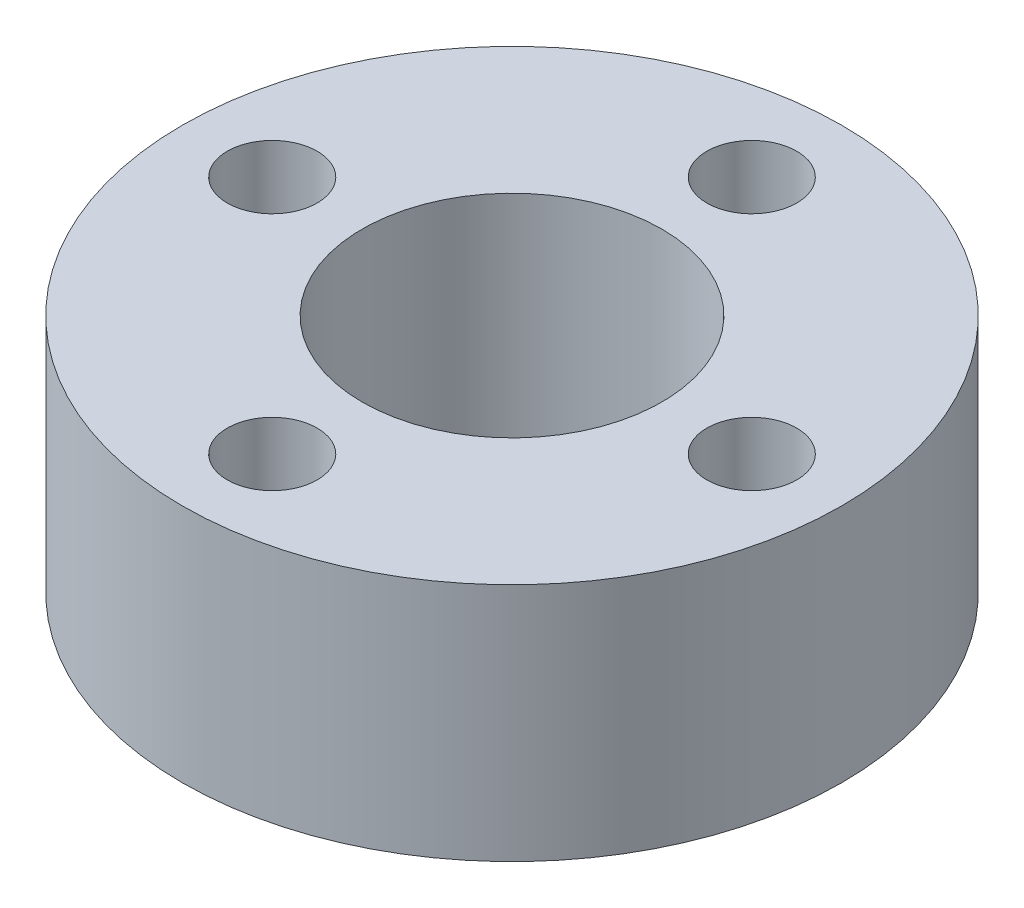
ISO-10303-21;
HEADER;
FILE_DESCRIPTION(('STEP AP214'),'2;1');
FILE_NAME('part.step','',(''),(''),'','','');
FILE_SCHEMA(('AUTOMOTIVE_DESIGN { 1 0 10303 214 1 1 1 1 }'));
ENDSEC;
DATA;
#1=APPLICATION_CONTEXT('core data for automotive mechanical design processes');
#2=APPLICATION_PROTOCOL_DEFINITION('international standard','automotive_design',2000,#1);
#3=PRODUCT_CONTEXT('',#1,'mechanical');
#4=PRODUCT('Part','Part','',(#3));
#5=PRODUCT_RELATED_PRODUCT_CATEGORY('part','',(#4));
#6=PRODUCT_DEFINITION_FORMATION('','',#4);
#7=PRODUCT_DEFINITION_CONTEXT('part definition',#1,'design');
#8=PRODUCT_DEFINITION('design','',#6,#7);
#9=PRODUCT_DEFINITION_SHAPE('','',#8);
#10=(LENGTH_UNIT() NAMED_UNIT(*) SI_UNIT(.MILLI.,.METRE.));
#11=(NAMED_UNIT(*) PLANE_ANGLE_UNIT() SI_UNIT($,.RADIAN.));
#12=(NAMED_UNIT(*) SI_UNIT($,.STERADIAN.) SOLID_ANGLE_UNIT());
#13=UNCERTAINTY_MEASURE_WITH_UNIT(LENGTH_MEASURE(1.E-05),#10,'distance_accuracy_value','');
#14=(GEOMETRIC_REPRESENTATION_CONTEXT(3) GLOBAL_UNCERTAINTY_ASSIGNED_CONTEXT((#13)) GLOBAL_UNIT_ASSIGNED_CONTEXT((#10,
#11,#12)) REPRESENTATION_CONTEXT('',''));
#15=CARTESIAN_POINT('',(0.,0.,0.));
#16=DIRECTION('',(0.,0.,1.));
#17=DIRECTION('',(1.,0.,0.));
#18=AXIS2_PLACEMENT_3D('',#15,#16,#17);
#19=CARTESIAN_POINT('',(0.,8.,0.));
#20=DIRECTION('',(0.,1.,0.));
#21=DIRECTION('',(0.,0.,1.));
#22=AXIS2_PLACEMENT_3D('',#19,#20,#21);
#23=PLANE('',#22);
#24=CARTESIAN_POINT('',(0.,8.,8.));
#25=DIRECTION('',(0.,1.,0.));
#26=DIRECTION('',(0.,0.,1.));
#27=AXIS2_PLACEMENT_3D('',#24,#25,#26);
#28=CIRCLE('',#27,1.50000000000005);
#29=CARTESIAN_POINT('',(0.,8.,9.50000000000006));
#30=VERTEX_POINT('',#29);
#31=EDGE_CURVE('E61',#30,#30,#28,.T.);
#32=ORIENTED_EDGE('',*,*,#31,.F.);
#33=EDGE_LOOP('',(#32));
#34=FACE_BOUND('',#33,.T.);
#35=CARTESIAN_POINT('',(0.,8.,-8.));
#36=DIRECTION('',(0.,1.,0.));
#37=DIRECTION('',(0.,0.,1.));
#38=AXIS2_PLACEMENT_3D('',#35,#36,#37);
#39=CIRCLE('',#38,1.5);
#40=CARTESIAN_POINT('',(0.,8.,-6.5));
#41=VERTEX_POINT('',#40);
#42=EDGE_CURVE('E49',#41,#41,#39,.T.);
#43=ORIENTED_EDGE('',*,*,#42,.F.);
#44=EDGE_LOOP('',(#43));
#45=FACE_BOUND('',#44,.T.);
#46=CARTESIAN_POINT('',(0.,8.,0.));
#47=DIRECTION('',(0.,1.,0.));
#48=DIRECTION('',(0.,0.,1.));
#49=AXIS2_PLACEMENT_3D('',#46,#47,#48);
#50=CIRCLE('',#49,11.);
#51=CARTESIAN_POINT('',(0.,8.,11.));
#52=VERTEX_POINT('',#51);
#53=EDGE_CURVE('E10',#52,#52,#50,.T.);
#54=ORIENTED_EDGE('',*,*,#53,.T.);
#55=EDGE_LOOP('',(#54));
#56=FACE_BOUND('',#55,.T.);
#57=CARTESIAN_POINT('',(0.,8.,0.));
#58=DIRECTION('',(0.,1.,0.));
#59=DIRECTION('',(0.,0.,1.));
#60=AXIS2_PLACEMENT_3D('',#57,#58,#59);
#61=CIRCLE('',#60,5.);
#62=CARTESIAN_POINT('',(0.,8.,5.));
#63=VERTEX_POINT('',#62);
#64=EDGE_CURVE('E44',#63,#63,#61,.T.);
#65=ORIENTED_EDGE('',*,*,#64,.F.);
#66=EDGE_LOOP('',(#65));
#67=FACE_BOUND('',#66,.T.);
#68=CARTESIAN_POINT('',(8.,8.,0.));
#69=DIRECTION('',(0.,1.,0.));
#70=DIRECTION('',(0.,0.,1.));
#71=AXIS2_PLACEMENT_3D('',#68,#69,#70);
#72=CIRCLE('',#71,1.50000000000003);
#73=CARTESIAN_POINT('',(8.,8.,1.50000000000003));
#74=VERTEX_POINT('',#73);
#75=EDGE_CURVE('E55',#74,#74,#72,.T.);
#76=ORIENTED_EDGE('',*,*,#75,.F.);
#77=EDGE_LOOP('',(#76));
#78=FACE_BOUND('',#77,.T.);
#79=CARTESIAN_POINT('',(-8.,8.,0.));
#80=DIRECTION('',(0.,1.,0.));
#81=DIRECTION('',(0.,0.,1.));
#82=AXIS2_PLACEMENT_3D('',#79,#80,#81);
#83=CIRCLE('',#82,1.50000000000008);
#84=CARTESIAN_POINT('',(-8.,8.,1.50000000000008));
#85=VERTEX_POINT('',#84);
#86=EDGE_CURVE('E67',#85,#85,#83,.T.);
#87=ORIENTED_EDGE('',*,*,#86,.F.);
#88=EDGE_LOOP('',(#87));
#89=FACE_BOUND('',#88,.T.);
#90=ADVANCED_FACE('F33',(#34,#45,#56,#67,#78,#89),#23,.T.);
#91=CARTESIAN_POINT('',(0.,0.,0.));
#92=DIRECTION('',(0.,1.,0.));
#93=DIRECTION('',(0.,0.,1.));
#94=AXIS2_PLACEMENT_3D('',#91,#92,#93);
#95=PLANE('',#94);
#96=CARTESIAN_POINT('',(0.,0.,0.));
#97=DIRECTION('',(0.,1.,0.));
#98=DIRECTION('',(0.,0.,1.));
#99=AXIS2_PLACEMENT_3D('',#96,#97,#98);
#100=CIRCLE('',#99,11.);
#101=CARTESIAN_POINT('',(0.,0.,11.));
#102=VERTEX_POINT('',#101);
#103=EDGE_CURVE('E37',#102,#102,#100,.T.);
#104=ORIENTED_EDGE('',*,*,#103,.F.);
#105=EDGE_LOOP('',(#104));
#106=FACE_BOUND('',#105,.T.);
#107=CARTESIAN_POINT('',(0.,0.,0.));
#108=DIRECTION('',(0.,1.,0.));
#109=DIRECTION('',(0.,0.,1.));
#110=AXIS2_PLACEMENT_3D('',#107,#108,#109);
#111=CIRCLE('',#110,5.);
#112=CARTESIAN_POINT('',(0.,0.,5.));
#113=VERTEX_POINT('',#112);
#114=EDGE_CURVE('E46',#113,#113,#111,.T.);
#115=ORIENTED_EDGE('',*,*,#114,.T.);
#116=EDGE_LOOP('',(#115));
#117=FACE_BOUND('',#116,.T.);
#118=CARTESIAN_POINT('',(0.,0.,-8.));
#119=DIRECTION('',(0.,1.,0.));
#120=DIRECTION('',(0.,0.,1.));
#121=AXIS2_PLACEMENT_3D('',#118,#119,#120);
#122=CIRCLE('',#121,1.5);
#123=CARTESIAN_POINT('',(0.,0.,-6.5));
#124=VERTEX_POINT('',#123);
#125=EDGE_CURVE('E52',#124,#124,#122,.T.);
#126=ORIENTED_EDGE('',*,*,#125,.T.);
#127=EDGE_LOOP('',(#126));
#128=FACE_BOUND('',#127,.T.);
#129=CARTESIAN_POINT('',(8.,0.,0.));
#130=DIRECTION('',(0.,1.,0.));
#131=DIRECTION('',(0.,0.,1.));
#132=AXIS2_PLACEMENT_3D('',#129,#130,#131);
#133=CIRCLE('',#132,1.50000000000003);
#134=CARTESIAN_POINT('',(8.,0.,1.50000000000003));
#135=VERTEX_POINT('',#134);
#136=EDGE_CURVE('E58',#135,#135,#133,.T.);
#137=ORIENTED_EDGE('',*,*,#136,.T.);
#138=EDGE_LOOP('',(#137));
#139=FACE_BOUND('',#138,.T.);
#140=CARTESIAN_POINT('',(0.,0.,8.));
#141=DIRECTION('',(0.,1.,0.));
#142=DIRECTION('',(0.,0.,1.));
#143=AXIS2_PLACEMENT_3D('',#140,#141,#142);
#144=CIRCLE('',#143,1.50000000000005);
#145=CARTESIAN_POINT('',(0.,0.,9.50000000000006));
#146=VERTEX_POINT('',#145);
#147=EDGE_CURVE('E64',#146,#146,#144,.T.);
#148=ORIENTED_EDGE('',*,*,#147,.T.);
#149=EDGE_LOOP('',(#148));
#150=FACE_BOUND('',#149,.T.);
#151=CARTESIAN_POINT('',(-8.,0.,0.));
#152=DIRECTION('',(0.,1.,0.));
#153=DIRECTION('',(0.,0.,1.));
#154=AXIS2_PLACEMENT_3D('',#151,#152,#153);
#155=CIRCLE('',#154,1.50000000000008);
#156=CARTESIAN_POINT('',(-8.,0.,1.50000000000008));
#157=VERTEX_POINT('',#156);
#158=EDGE_CURVE('E70',#157,#157,#155,.T.);
#159=ORIENTED_EDGE('',*,*,#158,.T.);
#160=EDGE_LOOP('',(#159));
#161=FACE_BOUND('',#160,.T.);
#162=ADVANCED_FACE('F80',(#106,#117,#128,#139,#150,#161),#95,.F.);
#163=CARTESIAN_POINT('',(0.,8.,0.));
#164=DIRECTION('',(0.,-1.,0.));
#165=DIRECTION('',(0.,0.,-1.));
#166=AXIS2_PLACEMENT_3D('',#163,#164,#165);
#167=CYLINDRICAL_SURFACE('',#166,11.);
#168=ORIENTED_EDGE('',*,*,#53,.F.);
#169=EDGE_LOOP('',(#168));
#170=FACE_BOUND('',#169,.T.);
#171=ORIENTED_EDGE('',*,*,#103,.T.);
#172=EDGE_LOOP('',(#171));
#173=FACE_BOUND('',#172,.T.);
#174=ADVANCED_FACE('F35',(#170,#173),#167,.T.);
#175=CARTESIAN_POINT('',(0.,8.,0.));
#176=DIRECTION('',(0.,-1.,0.));
#177=DIRECTION('',(0.,0.,-1.));
#178=AXIS2_PLACEMENT_3D('',#175,#176,#177);
#179=CYLINDRICAL_SURFACE('',#178,5.);
#180=ORIENTED_EDGE('',*,*,#64,.T.);
#181=EDGE_LOOP('',(#180));
#182=FACE_BOUND('',#181,.T.);
#183=ORIENTED_EDGE('',*,*,#114,.F.);
#184=EDGE_LOOP('',(#183));
#185=FACE_BOUND('',#184,.T.);
#186=ADVANCED_FACE('F90',(#182,#185),#179,.F.);
#187=CARTESIAN_POINT('',(0.,8.,-8.));
#188=DIRECTION('',(0.,-1.,0.));
#189=DIRECTION('',(0.,0.,-1.));
#190=AXIS2_PLACEMENT_3D('',#187,#188,#189);
#191=CYLINDRICAL_SURFACE('',#190,1.5);
#192=ORIENTED_EDGE('',*,*,#42,.T.);
#193=EDGE_LOOP('',(#192));
#194=FACE_BOUND('',#193,.T.);
#195=ORIENTED_EDGE('',*,*,#125,.F.);
#196=EDGE_LOOP('',(#195));
#197=FACE_BOUND('',#196,.T.);
#198=ADVANCED_FACE('F93',(#194,#197),#191,.F.);
#199=CARTESIAN_POINT('',(8.,8.,0.));
#200=DIRECTION('',(0.,-1.,0.));
#201=DIRECTION('',(0.,0.,-1.));
#202=AXIS2_PLACEMENT_3D('',#199,#200,#201);
#203=CYLINDRICAL_SURFACE('',#202,1.50000000000003);
#204=ORIENTED_EDGE('',*,*,#75,.T.);
#205=EDGE_LOOP('',(#204));
#206=FACE_BOUND('',#205,.T.);
#207=ORIENTED_EDGE('',*,*,#136,.F.);
#208=EDGE_LOOP('',(#207));
#209=FACE_BOUND('',#208,.T.);
#210=ADVANCED_FACE('F97',(#206,#209),#203,.F.);
#211=CARTESIAN_POINT('',(0.,8.,8.));
#212=DIRECTION('',(0.,-1.,0.));
#213=DIRECTION('',(0.,0.,-1.));
#214=AXIS2_PLACEMENT_3D('',#211,#212,#213);
#215=CYLINDRICAL_SURFACE('',#214,1.50000000000005);
#216=ORIENTED_EDGE('',*,*,#31,.T.);
#217=EDGE_LOOP('',(#216));
#218=FACE_BOUND('',#217,.T.);
#219=ORIENTED_EDGE('',*,*,#147,.F.);
#220=EDGE_LOOP('',(#219));
#221=FACE_BOUND('',#220,.T.);
#222=ADVANCED_FACE('F101',(#218,#221),#215,.F.);
#223=CARTESIAN_POINT('',(-8.,8.,0.));
#224=DIRECTION('',(0.,-1.,0.));
#225=DIRECTION('',(0.,0.,-1.));
#226=AXIS2_PLACEMENT_3D('',#223,#224,#225);
#227=CYLINDRICAL_SURFACE('',#226,1.50000000000008);
#228=ORIENTED_EDGE('',*,*,#86,.T.);
#229=EDGE_LOOP('',(#228));
#230=FACE_BOUND('',#229,.T.);
#231=ORIENTED_EDGE('',*,*,#158,.F.);
#232=EDGE_LOOP('',(#231));
#233=FACE_BOUND('',#232,.T.);
#234=ADVANCED_FACE('F76',(#230,#233),#227,.F.);
#235=CLOSED_SHELL('',(#90,#162,#174,#186,#198,#210,#222,#234));
#236=MANIFOLD_SOLID_BREP('B2',#235);
#237=ADVANCED_BREP_SHAPE_REPRESENTATION('',(#18,#236),#14);
#238=SHAPE_DEFINITION_REPRESENTATION(#9,#237);
ENDSEC;
END-ISO-10303-21;
